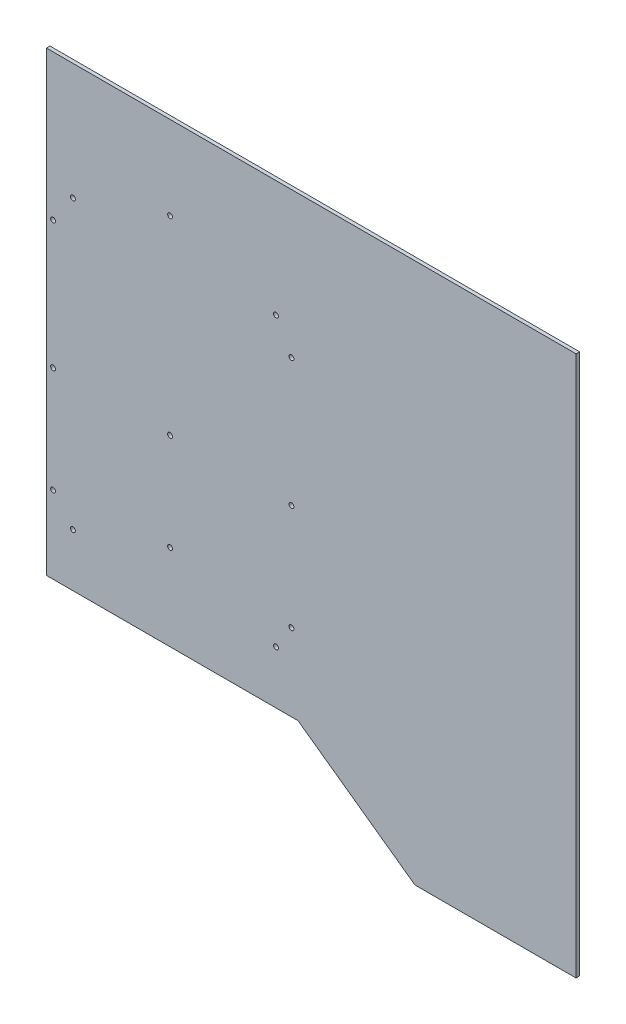
ISO-10303-21;
HEADER;
FILE_DESCRIPTION(('STEP AP214'),'2;1');
FILE_NAME('part.step','',(''),(''),'','','');
FILE_SCHEMA(('AUTOMOTIVE_DESIGN { 1 0 10303 214 1 1 1 1 }'));
ENDSEC;
DATA;
#1=APPLICATION_CONTEXT('core data for automotive mechanical design processes');
#2=APPLICATION_PROTOCOL_DEFINITION('international standard','automotive_design',2000,#1);
#3=PRODUCT_CONTEXT('',#1,'mechanical');
#4=PRODUCT('Part','Part','',(#3));
#5=PRODUCT_RELATED_PRODUCT_CATEGORY('part','',(#4));
#6=PRODUCT_DEFINITION_FORMATION('','',#4);
#7=PRODUCT_DEFINITION_CONTEXT('part definition',#1,'design');
#8=PRODUCT_DEFINITION('design','',#6,#7);
#9=PRODUCT_DEFINITION_SHAPE('','',#8);
#10=(LENGTH_UNIT() NAMED_UNIT(*) SI_UNIT(.MILLI.,.METRE.));
#11=(NAMED_UNIT(*) PLANE_ANGLE_UNIT() SI_UNIT($,.RADIAN.));
#12=(NAMED_UNIT(*) SI_UNIT($,.STERADIAN.) SOLID_ANGLE_UNIT());
#13=UNCERTAINTY_MEASURE_WITH_UNIT(LENGTH_MEASURE(1.E-05),#10,'distance_accuracy_value','');
#14=(GEOMETRIC_REPRESENTATION_CONTEXT(3) GLOBAL_UNCERTAINTY_ASSIGNED_CONTEXT((#13)) GLOBAL_UNIT_ASSIGNED_CONTEXT((#10,
#11,#12)) REPRESENTATION_CONTEXT('',''));
#15=CARTESIAN_POINT('',(0.,0.,0.));
#16=DIRECTION('',(0.,0.,1.));
#17=DIRECTION('',(1.,0.,0.));
#18=AXIS2_PLACEMENT_3D('',#15,#16,#17);
#19=CARTESIAN_POINT('',(-600.,-435.,8.));
#20=DIRECTION('',(1.,0.,0.));
#21=DIRECTION('',(0.,0.,-1.));
#22=AXIS2_PLACEMENT_3D('',#19,#20,#21);
#23=PLANE('',#22);
#24=DIRECTION('',(0.,-1.,0.));
#25=VECTOR('',#24,1.);
#26=CARTESIAN_POINT('',(-600.,-435.,0.));
#27=LINE('',#26,#25);
#28=CARTESIAN_POINT('',(-600.,600.,0.));
#29=VERTEX_POINT('',#28);
#30=CARTESIAN_POINT('',(-600.,-435.,0.));
#31=VERTEX_POINT('',#30);
#32=EDGE_CURVE('E128',#29,#31,#27,.T.);
#33=ORIENTED_EDGE('',*,*,#32,.T.);
#34=DIRECTION('',(0.,0.,-1.));
#35=VECTOR('',#34,1.);
#36=CARTESIAN_POINT('',(-600.,-435.,8.));
#37=LINE('',#36,#35);
#38=CARTESIAN_POINT('',(-600.,-435.,8.));
#39=VERTEX_POINT('',#38);
#40=EDGE_CURVE('E11',#39,#31,#37,.T.);
#41=ORIENTED_EDGE('',*,*,#40,.F.);
#42=DIRECTION('',(0.,-1.,0.));
#43=VECTOR('',#42,1.);
#44=CARTESIAN_POINT('',(-600.,-435.,8.));
#45=LINE('',#44,#43);
#46=CARTESIAN_POINT('',(-600.,600.,8.));
#47=VERTEX_POINT('',#46);
#48=EDGE_CURVE('E145',#47,#39,#45,.T.);
#49=ORIENTED_EDGE('',*,*,#48,.F.);
#50=DIRECTION('',(0.,0.,-1.));
#51=VECTOR('',#50,1.);
#52=CARTESIAN_POINT('',(-600.,600.,8.));
#53=LINE('',#52,#51);
#54=EDGE_CURVE('E124',#47,#29,#53,.T.);
#55=ORIENTED_EDGE('',*,*,#54,.T.);
#56=EDGE_LOOP('',(#33,#41,#49,#55));
#57=FACE_BOUND('',#56,.T.);
#58=ADVANCED_FACE('F39',(#57),#23,.F.);
#59=CARTESIAN_POINT('',(-30.0000000000002,-435.,8.));
#60=DIRECTION('',(0.,1.,0.));
#61=DIRECTION('',(-1.,0.,0.));
#62=AXIS2_PLACEMENT_3D('',#59,#60,#61);
#63=PLANE('',#62);
#64=DIRECTION('',(1.,0.,0.));
#65=VECTOR('',#64,1.);
#66=CARTESIAN_POINT('',(-30.0000000000002,-435.,0.));
#67=LINE('',#66,#65);
#68=CARTESIAN_POINT('',(-30.0000000000002,-435.,0.));
#69=VERTEX_POINT('',#68);
#70=EDGE_CURVE('E132',#31,#69,#67,.T.);
#71=ORIENTED_EDGE('',*,*,#70,.T.);
#72=DIRECTION('',(0.,0.,-1.));
#73=VECTOR('',#72,1.);
#74=CARTESIAN_POINT('',(-30.0000000000002,-435.,8.));
#75=LINE('',#74,#73);
#76=CARTESIAN_POINT('',(-30.0000000000002,-435.,8.));
#77=VERTEX_POINT('',#76);
#78=EDGE_CURVE('E48',#77,#69,#75,.T.);
#79=ORIENTED_EDGE('',*,*,#78,.F.);
#80=DIRECTION('',(1.,0.,0.));
#81=VECTOR('',#80,1.);
#82=CARTESIAN_POINT('',(-30.0000000000002,-435.,8.));
#83=LINE('',#82,#81);
#84=EDGE_CURVE('E93',#39,#77,#83,.T.);
#85=ORIENTED_EDGE('',*,*,#84,.F.);
#86=ORIENTED_EDGE('',*,*,#40,.T.);
#87=EDGE_LOOP('',(#71,#79,#85,#86));
#88=FACE_BOUND('',#87,.T.);
#89=ADVANCED_FACE('F174',(#88),#63,.F.);
#90=CARTESIAN_POINT('',(235.,-625.,8.));
#91=DIRECTION('',(0.582687773294948,0.812696104858744,0.));
#92=DIRECTION('',(-0.812696104858745,0.582687773294948,0.));
#93=AXIS2_PLACEMENT_3D('',#90,#91,#92);
#94=PLANE('',#93);
#95=DIRECTION('',(0.812696104858744,-0.582687773294948,0.));
#96=VECTOR('',#95,1.);
#97=CARTESIAN_POINT('',(235.,-625.,0.));
#98=LINE('',#97,#96);
#99=CARTESIAN_POINT('',(235.,-625.,0.));
#100=VERTEX_POINT('',#99);
#101=EDGE_CURVE('E136',#69,#100,#98,.T.);
#102=ORIENTED_EDGE('',*,*,#101,.T.);
#103=DIRECTION('',(0.,0.,-1.));
#104=VECTOR('',#103,1.);
#105=CARTESIAN_POINT('',(235.,-625.,8.));
#106=LINE('',#105,#104);
#107=CARTESIAN_POINT('',(235.,-625.,8.));
#108=VERTEX_POINT('',#107);
#109=EDGE_CURVE('E117',#108,#100,#106,.T.);
#110=ORIENTED_EDGE('',*,*,#109,.F.);
#111=DIRECTION('',(0.812696104858744,-0.582687773294948,0.));
#112=VECTOR('',#111,1.);
#113=CARTESIAN_POINT('',(235.,-625.,8.));
#114=LINE('',#113,#112);
#115=EDGE_CURVE('E106',#77,#108,#114,.T.);
#116=ORIENTED_EDGE('',*,*,#115,.F.);
#117=ORIENTED_EDGE('',*,*,#78,.T.);
#118=EDGE_LOOP('',(#102,#110,#116,#117));
#119=FACE_BOUND('',#118,.T.);
#120=ADVANCED_FACE('F155',(#119),#94,.F.);
#121=CARTESIAN_POINT('',(600.,-625.,8.));
#122=DIRECTION('',(0.,1.,0.));
#123=DIRECTION('',(-1.,0.,0.));
#124=AXIS2_PLACEMENT_3D('',#121,#122,#123);
#125=PLANE('',#124);
#126=DIRECTION('',(1.,0.,0.));
#127=VECTOR('',#126,1.);
#128=CARTESIAN_POINT('',(600.,-625.,0.));
#129=LINE('',#128,#127);
#130=CARTESIAN_POINT('',(600.,-625.,0.));
#131=VERTEX_POINT('',#130);
#132=EDGE_CURVE('E115',#100,#131,#129,.T.);
#133=ORIENTED_EDGE('',*,*,#132,.T.);
#134=DIRECTION('',(0.,0.,-1.));
#135=VECTOR('',#134,1.);
#136=CARTESIAN_POINT('',(600.,-625.,8.));
#137=LINE('',#136,#135);
#138=CARTESIAN_POINT('',(600.,-625.,8.));
#139=VERTEX_POINT('',#138);
#140=EDGE_CURVE('E112',#139,#131,#137,.T.);
#141=ORIENTED_EDGE('',*,*,#140,.F.);
#142=DIRECTION('',(1.,0.,0.));
#143=VECTOR('',#142,1.);
#144=CARTESIAN_POINT('',(600.,-625.,8.));
#145=LINE('',#144,#143);
#146=EDGE_CURVE('E100',#108,#139,#145,.T.);
#147=ORIENTED_EDGE('',*,*,#146,.F.);
#148=ORIENTED_EDGE('',*,*,#109,.T.);
#149=EDGE_LOOP('',(#133,#141,#147,#148));
#150=FACE_BOUND('',#149,.T.);
#151=ADVANCED_FACE('F113',(#150),#125,.F.);
#152=CARTESIAN_POINT('',(600.,600.,8.));
#153=DIRECTION('',(-1.,0.,0.));
#154=DIRECTION('',(0.,-1.,0.));
#155=AXIS2_PLACEMENT_3D('',#152,#153,#154);
#156=PLANE('',#155);
#157=DIRECTION('',(0.,1.,0.));
#158=VECTOR('',#157,1.);
#159=CARTESIAN_POINT('',(600.,600.,0.));
#160=LINE('',#159,#158);
#161=CARTESIAN_POINT('',(600.,600.,0.));
#162=VERTEX_POINT('',#161);
#163=EDGE_CURVE('E79',#131,#162,#160,.T.);
#164=ORIENTED_EDGE('',*,*,#163,.T.);
#165=DIRECTION('',(0.,0.,-1.));
#166=VECTOR('',#165,1.);
#167=CARTESIAN_POINT('',(600.,600.,8.));
#168=LINE('',#167,#166);
#169=CARTESIAN_POINT('',(600.,600.,8.));
#170=VERTEX_POINT('',#169);
#171=EDGE_CURVE('E118',#170,#162,#168,.T.);
#172=ORIENTED_EDGE('',*,*,#171,.F.);
#173=DIRECTION('',(0.,1.,0.));
#174=VECTOR('',#173,1.);
#175=CARTESIAN_POINT('',(600.,600.,8.));
#176=LINE('',#175,#174);
#177=EDGE_CURVE('E104',#139,#170,#176,.T.);
#178=ORIENTED_EDGE('',*,*,#177,.F.);
#179=ORIENTED_EDGE('',*,*,#140,.T.);
#180=EDGE_LOOP('',(#164,#172,#178,#179));
#181=FACE_BOUND('',#180,.T.);
#182=ADVANCED_FACE('F120',(#181),#156,.F.);
#183=CARTESIAN_POINT('',(-600.,600.,8.));
#184=DIRECTION('',(0.,-1.,0.));
#185=DIRECTION('',(0.,0.,-1.));
#186=AXIS2_PLACEMENT_3D('',#183,#184,#185);
#187=PLANE('',#186);
#188=DIRECTION('',(-1.,0.,0.));
#189=VECTOR('',#188,1.);
#190=CARTESIAN_POINT('',(-600.,600.,0.));
#191=LINE('',#190,#189);
#192=EDGE_CURVE('E85',#162,#29,#191,.T.);
#193=ORIENTED_EDGE('',*,*,#192,.T.);
#194=ORIENTED_EDGE('',*,*,#54,.F.);
#195=DIRECTION('',(-1.,0.,0.));
#196=VECTOR('',#195,1.);
#197=CARTESIAN_POINT('',(-600.,600.,8.));
#198=LINE('',#197,#196);
#199=EDGE_CURVE('E56',#170,#47,#198,.T.);
#200=ORIENTED_EDGE('',*,*,#199,.F.);
#201=ORIENTED_EDGE('',*,*,#171,.T.);
#202=EDGE_LOOP('',(#193,#194,#200,#201));
#203=FACE_BOUND('',#202,.T.);
#204=ADVANCED_FACE('F162',(#203),#187,.F.);
#205=CARTESIAN_POINT('',(0.,0.,8.));
#206=DIRECTION('',(0.,0.,-1.));
#207=DIRECTION('',(-1.,0.,0.));
#208=AXIS2_PLACEMENT_3D('',#205,#206,#207);
#209=PLANE('',#208);
#210=CARTESIAN_POINT('',(-540.,336.,8.));
#211=DIRECTION('',(0.,0.,1.));
#212=DIRECTION('',(1.,0.,0.));
#213=AXIS2_PLACEMENT_3D('',#210,#211,#212);
#214=CIRCLE('',#213,5.49999999999996);
#215=CARTESIAN_POINT('',(-534.5,336.,8.));
#216=VERTEX_POINT('',#215);
#217=EDGE_CURVE('E347',#216,#216,#214,.T.);
#218=ORIENTED_EDGE('',*,*,#217,.F.);
#219=EDGE_LOOP('',(#218));
#220=FACE_BOUND('',#219,.T.);
#221=CARTESIAN_POINT('',(-585.,-20.0000000000002,8.));
#222=DIRECTION('',(0.,0.,1.));
#223=DIRECTION('',(1.,0.,0.));
#224=AXIS2_PLACEMENT_3D('',#221,#222,#223);
#225=CIRCLE('',#224,5.49999999999996);
#226=CARTESIAN_POINT('',(-579.5,-20.0000000000002,8.));
#227=VERTEX_POINT('',#226);
#228=EDGE_CURVE('E363',#227,#227,#225,.T.);
#229=ORIENTED_EDGE('',*,*,#228,.F.);
#230=EDGE_LOOP('',(#229));
#231=FACE_BOUND('',#230,.T.);
#232=CARTESIAN_POINT('',(-44.8722661893196,270.,8.));
#233=DIRECTION('',(0.,0.,1.));
#234=DIRECTION('',(1.,0.,0.));
#235=AXIS2_PLACEMENT_3D('',#232,#233,#234);
#236=CIRCLE('',#235,5.5);
#237=CARTESIAN_POINT('',(-39.3722661893196,270.,8.));
#238=VERTEX_POINT('',#237);
#239=EDGE_CURVE('E452',#238,#238,#236,.T.);
#240=ORIENTED_EDGE('',*,*,#239,.F.);
#241=EDGE_LOOP('',(#240));
#242=FACE_BOUND('',#241,.T.);
#243=CARTESIAN_POINT('',(-585.,270.,8.));
#244=DIRECTION('',(0.,0.,1.));
#245=DIRECTION('',(1.,0.,0.));
#246=AXIS2_PLACEMENT_3D('',#243,#244,#245);
#247=CIRCLE('',#246,5.49999999999996);
#248=CARTESIAN_POINT('',(-579.5,270.,8.));
#249=VERTEX_POINT('',#248);
#250=EDGE_CURVE('E460',#249,#249,#247,.T.);
#251=ORIENTED_EDGE('',*,*,#250,.F.);
#252=EDGE_LOOP('',(#251));
#253=FACE_BOUND('',#252,.T.);
#254=CARTESIAN_POINT('',(-79.8722661893196,336.,8.));
#255=DIRECTION('',(0.,0.,1.));
#256=DIRECTION('',(1.,0.,0.));
#257=AXIS2_PLACEMENT_3D('',#254,#255,#256);
#258=CIRCLE('',#257,5.5);
#259=CARTESIAN_POINT('',(-74.3722661893196,336.,8.));
#260=VERTEX_POINT('',#259);
#261=EDGE_CURVE('E352',#260,#260,#258,.T.);
#262=ORIENTED_EDGE('',*,*,#261,.F.);
#263=EDGE_LOOP('',(#262));
#264=FACE_BOUND('',#263,.T.);
#265=CARTESIAN_POINT('',(-44.8722661893196,-20.0000000000002,8.));
#266=DIRECTION('',(0.,0.,1.));
#267=DIRECTION('',(1.,0.,0.));
#268=AXIS2_PLACEMENT_3D('',#265,#266,#267);
#269=CIRCLE('',#268,5.5);
#270=CARTESIAN_POINT('',(-39.3722661893196,-20.0000000000002,8.));
#271=VERTEX_POINT('',#270);
#272=EDGE_CURVE('E389',#271,#271,#269,.T.);
#273=ORIENTED_EDGE('',*,*,#272,.F.);
#274=EDGE_LOOP('',(#273));
#275=FACE_BOUND('',#274,.T.);
#276=CARTESIAN_POINT('',(-44.8722661893195,-260.,8.));
#277=DIRECTION('',(0.,0.,1.));
#278=DIRECTION('',(1.,0.,0.));
#279=AXIS2_PLACEMENT_3D('',#276,#277,#278);
#280=CIRCLE('',#279,5.5);
#281=CARTESIAN_POINT('',(-39.3722661893195,-260.,8.));
#282=VERTEX_POINT('',#281);
#283=EDGE_CURVE('E381',#282,#282,#280,.T.);
#284=ORIENTED_EDGE('',*,*,#283,.F.);
#285=EDGE_LOOP('',(#284));
#286=FACE_BOUND('',#285,.T.);
#287=CARTESIAN_POINT('',(-79.8722661893195,-315.,8.));
#288=DIRECTION('',(0.,0.,1.));
#289=DIRECTION('',(1.,0.,0.));
#290=AXIS2_PLACEMENT_3D('',#287,#288,#289);
#291=CIRCLE('',#290,5.5);
#292=CARTESIAN_POINT('',(-74.3722661893195,-315.,8.));
#293=VERTEX_POINT('',#292);
#294=EDGE_CURVE('E371',#293,#293,#291,.T.);
#295=ORIENTED_EDGE('',*,*,#294,.F.);
#296=EDGE_LOOP('',(#295));
#297=FACE_BOUND('',#296,.T.);
#298=CARTESIAN_POINT('',(-319.872266189319,411.,8.));
#299=DIRECTION('',(0.,0.,1.));
#300=DIRECTION('',(1.,0.,0.));
#301=AXIS2_PLACEMENT_3D('',#298,#299,#300);
#302=CIRCLE('',#301,5.50000000000002);
#303=CARTESIAN_POINT('',(-314.372266189319,411.,8.));
#304=VERTEX_POINT('',#303);
#305=EDGE_CURVE('E470',#304,#304,#302,.T.);
#306=ORIENTED_EDGE('',*,*,#305,.F.);
#307=EDGE_LOOP('',(#306));
#308=FACE_BOUND('',#307,.T.);
#309=CARTESIAN_POINT('',(-319.87226618932,-20.0000000000002,8.));
#310=DIRECTION('',(0.,0.,1.));
#311=DIRECTION('',(1.,0.,0.));
#312=AXIS2_PLACEMENT_3D('',#309,#310,#311);
#313=CIRCLE('',#312,5.50000000000002);
#314=CARTESIAN_POINT('',(-314.37226618932,-20.0000000000002,8.));
#315=VERTEX_POINT('',#314);
#316=EDGE_CURVE('E476',#315,#315,#313,.T.);
#317=ORIENTED_EDGE('',*,*,#316,.F.);
#318=EDGE_LOOP('',(#317));
#319=FACE_BOUND('',#318,.T.);
#320=CARTESIAN_POINT('',(-319.872266189319,-240.,8.));
#321=DIRECTION('',(0.,0.,1.));
#322=DIRECTION('',(1.,0.,0.));
#323=AXIS2_PLACEMENT_3D('',#320,#321,#322);
#324=CIRCLE('',#323,5.50000000000002);
#325=CARTESIAN_POINT('',(-314.372266189319,-240.,8.));
#326=VERTEX_POINT('',#325);
#327=EDGE_CURVE('E441',#326,#326,#324,.T.);
#328=ORIENTED_EDGE('',*,*,#327,.F.);
#329=EDGE_LOOP('',(#328));
#330=FACE_BOUND('',#329,.T.);
#331=CARTESIAN_POINT('',(-585.,-260.,8.));
#332=DIRECTION('',(0.,0.,1.));
#333=DIRECTION('',(1.,0.,0.));
#334=AXIS2_PLACEMENT_3D('',#331,#332,#333);
#335=CIRCLE('',#334,5.49999999999996);
#336=CARTESIAN_POINT('',(-579.5,-260.,8.));
#337=VERTEX_POINT('',#336);
#338=EDGE_CURVE('E442',#337,#337,#335,.T.);
#339=ORIENTED_EDGE('',*,*,#338,.F.);
#340=EDGE_LOOP('',(#339));
#341=FACE_BOUND('',#340,.T.);
#342=CARTESIAN_POINT('',(-540.,-315.,8.));
#343=DIRECTION('',(0.,0.,1.));
#344=DIRECTION('',(1.,0.,0.));
#345=AXIS2_PLACEMENT_3D('',#342,#343,#344);
#346=CIRCLE('',#345,5.49999999999996);
#347=CARTESIAN_POINT('',(-534.5,-315.,8.));
#348=VERTEX_POINT('',#347);
#349=EDGE_CURVE('E380',#348,#348,#346,.T.);
#350=ORIENTED_EDGE('',*,*,#349,.F.);
#351=EDGE_LOOP('',(#350));
#352=FACE_BOUND('',#351,.T.);
#353=ORIENTED_EDGE('',*,*,#48,.T.);
#354=ORIENTED_EDGE('',*,*,#84,.T.);
#355=ORIENTED_EDGE('',*,*,#115,.T.);
#356=ORIENTED_EDGE('',*,*,#146,.T.);
#357=ORIENTED_EDGE('',*,*,#177,.T.);
#358=ORIENTED_EDGE('',*,*,#199,.T.);
#359=EDGE_LOOP('',(#353,#354,#355,#356,#357,#358));
#360=FACE_BOUND('',#359,.T.);
#361=ADVANCED_FACE('F102',(#220,#231,#242,#253,#264,#275,#286,#297,#308,#319,#330,#341,#352,
#360),#209,.F.);
#362=CARTESIAN_POINT('',(0.,0.,0.));
#363=DIRECTION('',(0.,0.,-1.));
#364=DIRECTION('',(-1.,0.,0.));
#365=AXIS2_PLACEMENT_3D('',#362,#363,#364);
#366=PLANE('',#365);
#367=CARTESIAN_POINT('',(-540.,336.,0.));
#368=DIRECTION('',(0.,0.,-1.));
#369=DIRECTION('',(-1.,0.,0.));
#370=AXIS2_PLACEMENT_3D('',#367,#368,#369);
#371=CIRCLE('',#370,5.49999999999996);
#372=CARTESIAN_POINT('',(-545.5,336.,0.));
#373=VERTEX_POINT('',#372);
#374=EDGE_CURVE('E350',#373,#373,#371,.F.);
#375=ORIENTED_EDGE('',*,*,#374,.T.);
#376=EDGE_LOOP('',(#375));
#377=FACE_BOUND('',#376,.T.);
#378=CARTESIAN_POINT('',(-585.,-20.0000000000002,0.));
#379=DIRECTION('',(0.,0.,-1.));
#380=DIRECTION('',(-1.,0.,0.));
#381=AXIS2_PLACEMENT_3D('',#378,#379,#380);
#382=CIRCLE('',#381,5.49999999999996);
#383=CARTESIAN_POINT('',(-590.5,-20.0000000000002,0.));
#384=VERTEX_POINT('',#383);
#385=EDGE_CURVE('E359',#384,#384,#382,.F.);
#386=ORIENTED_EDGE('',*,*,#385,.T.);
#387=EDGE_LOOP('',(#386));
#388=FACE_BOUND('',#387,.T.);
#389=CARTESIAN_POINT('',(-44.8722661893196,270.,0.));
#390=DIRECTION('',(0.,0.,-1.));
#391=DIRECTION('',(-1.,0.,0.));
#392=AXIS2_PLACEMENT_3D('',#389,#390,#391);
#393=CIRCLE('',#392,5.5);
#394=CARTESIAN_POINT('',(-50.3722661893196,270.,0.));
#395=VERTEX_POINT('',#394);
#396=EDGE_CURVE('E367',#395,#395,#393,.F.);
#397=ORIENTED_EDGE('',*,*,#396,.T.);
#398=EDGE_LOOP('',(#397));
#399=FACE_BOUND('',#398,.T.);
#400=CARTESIAN_POINT('',(-585.,270.,0.));
#401=DIRECTION('',(0.,0.,-1.));
#402=DIRECTION('',(-1.,0.,0.));
#403=AXIS2_PLACEMENT_3D('',#400,#401,#402);
#404=CIRCLE('',#403,5.49999999999996);
#405=CARTESIAN_POINT('',(-590.5,270.,0.));
#406=VERTEX_POINT('',#405);
#407=EDGE_CURVE('E456',#406,#406,#404,.F.);
#408=ORIENTED_EDGE('',*,*,#407,.T.);
#409=EDGE_LOOP('',(#408));
#410=FACE_BOUND('',#409,.T.);
#411=CARTESIAN_POINT('',(-79.8722661893196,336.,0.));
#412=DIRECTION('',(0.,0.,-1.));
#413=DIRECTION('',(-1.,0.,0.));
#414=AXIS2_PLACEMENT_3D('',#411,#412,#413);
#415=CIRCLE('',#414,5.5);
#416=CARTESIAN_POINT('',(-85.3722661893196,336.,0.));
#417=VERTEX_POINT('',#416);
#418=EDGE_CURVE('E357',#417,#417,#415,.F.);
#419=ORIENTED_EDGE('',*,*,#418,.T.);
#420=EDGE_LOOP('',(#419));
#421=FACE_BOUND('',#420,.T.);
#422=CARTESIAN_POINT('',(-44.8722661893196,-20.0000000000002,0.));
#423=DIRECTION('',(0.,0.,-1.));
#424=DIRECTION('',(-1.,0.,0.));
#425=AXIS2_PLACEMENT_3D('',#422,#423,#424);
#426=CIRCLE('',#425,5.5);
#427=CARTESIAN_POINT('',(-50.3722661893196,-20.0000000000002,0.));
#428=VERTEX_POINT('',#427);
#429=EDGE_CURVE('E385',#428,#428,#426,.F.);
#430=ORIENTED_EDGE('',*,*,#429,.T.);
#431=EDGE_LOOP('',(#430));
#432=FACE_BOUND('',#431,.T.);
#433=CARTESIAN_POINT('',(-44.8722661893195,-260.,0.));
#434=DIRECTION('',(0.,0.,-1.));
#435=DIRECTION('',(-1.,0.,0.));
#436=AXIS2_PLACEMENT_3D('',#433,#434,#435);
#437=CIRCLE('',#436,5.5);
#438=CARTESIAN_POINT('',(-50.3722661893195,-260.,0.));
#439=VERTEX_POINT('',#438);
#440=EDGE_CURVE('E376',#439,#439,#437,.F.);
#441=ORIENTED_EDGE('',*,*,#440,.T.);
#442=EDGE_LOOP('',(#441));
#443=FACE_BOUND('',#442,.T.);
#444=CARTESIAN_POINT('',(-79.8722661893195,-315.,0.));
#445=DIRECTION('',(0.,0.,-1.));
#446=DIRECTION('',(-1.,0.,0.));
#447=AXIS2_PLACEMENT_3D('',#444,#445,#446);
#448=CIRCLE('',#447,5.5);
#449=CARTESIAN_POINT('',(-85.3722661893195,-315.,0.));
#450=VERTEX_POINT('',#449);
#451=EDGE_CURVE('E375',#450,#450,#448,.F.);
#452=ORIENTED_EDGE('',*,*,#451,.T.);
#453=EDGE_LOOP('',(#452));
#454=FACE_BOUND('',#453,.T.);
#455=CARTESIAN_POINT('',(-319.872266189319,411.,0.));
#456=DIRECTION('',(0.,0.,-1.));
#457=DIRECTION('',(-1.,0.,0.));
#458=AXIS2_PLACEMENT_3D('',#455,#456,#457);
#459=CIRCLE('',#458,5.50000000000002);
#460=CARTESIAN_POINT('',(-325.372266189319,411.,0.));
#461=VERTEX_POINT('',#460);
#462=EDGE_CURVE('E427',#461,#461,#459,.F.);
#463=ORIENTED_EDGE('',*,*,#462,.T.);
#464=EDGE_LOOP('',(#463));
#465=FACE_BOUND('',#464,.T.);
#466=CARTESIAN_POINT('',(-319.87226618932,-20.0000000000002,0.));
#467=DIRECTION('',(0.,0.,-1.));
#468=DIRECTION('',(-1.,0.,0.));
#469=AXIS2_PLACEMENT_3D('',#466,#467,#468);
#470=CIRCLE('',#469,5.50000000000002);
#471=CARTESIAN_POINT('',(-325.37226618932,-20.0000000000002,0.));
#472=VERTEX_POINT('',#471);
#473=EDGE_CURVE('E431',#472,#472,#470,.F.);
#474=ORIENTED_EDGE('',*,*,#473,.T.);
#475=EDGE_LOOP('',(#474));
#476=FACE_BOUND('',#475,.T.);
#477=CARTESIAN_POINT('',(-319.872266189319,-240.,0.));
#478=DIRECTION('',(0.,0.,-1.));
#479=DIRECTION('',(-1.,0.,0.));
#480=AXIS2_PLACEMENT_3D('',#477,#478,#479);
#481=CIRCLE('',#480,5.50000000000002);
#482=CARTESIAN_POINT('',(-325.372266189319,-240.,0.));
#483=VERTEX_POINT('',#482);
#484=EDGE_CURVE('E435',#483,#483,#481,.F.);
#485=ORIENTED_EDGE('',*,*,#484,.T.);
#486=EDGE_LOOP('',(#485));
#487=FACE_BOUND('',#486,.T.);
#488=CARTESIAN_POINT('',(-585.,-260.,0.));
#489=DIRECTION('',(0.,0.,-1.));
#490=DIRECTION('',(-1.,0.,0.));
#491=AXIS2_PLACEMENT_3D('',#488,#489,#490);
#492=CIRCLE('',#491,5.49999999999996);
#493=CARTESIAN_POINT('',(-590.5,-260.,0.));
#494=VERTEX_POINT('',#493);
#495=EDGE_CURVE('E438',#494,#494,#492,.F.);
#496=ORIENTED_EDGE('',*,*,#495,.T.);
#497=EDGE_LOOP('',(#496));
#498=FACE_BOUND('',#497,.T.);
#499=CARTESIAN_POINT('',(-540.,-315.,0.));
#500=DIRECTION('',(0.,0.,-1.));
#501=DIRECTION('',(-1.,0.,0.));
#502=AXIS2_PLACEMENT_3D('',#499,#500,#501);
#503=CIRCLE('',#502,5.49999999999996);
#504=CARTESIAN_POINT('',(-545.5,-315.,0.));
#505=VERTEX_POINT('',#504);
#506=EDGE_CURVE('E133',#505,#505,#503,.F.);
#507=ORIENTED_EDGE('',*,*,#506,.T.);
#508=EDGE_LOOP('',(#507));
#509=FACE_BOUND('',#508,.T.);
#510=ORIENTED_EDGE('',*,*,#32,.F.);
#511=ORIENTED_EDGE('',*,*,#192,.F.);
#512=ORIENTED_EDGE('',*,*,#163,.F.);
#513=ORIENTED_EDGE('',*,*,#132,.F.);
#514=ORIENTED_EDGE('',*,*,#101,.F.);
#515=ORIENTED_EDGE('',*,*,#70,.F.);
#516=EDGE_LOOP('',(#510,#511,#512,#513,#514,#515));
#517=FACE_BOUND('',#516,.T.);
#518=ADVANCED_FACE('F158',(#377,#388,#399,#410,#421,#432,#443,#454,#465,#476,#487,#498,#509,
#517),#366,.T.);
#519=CARTESIAN_POINT('',(-540.,-315.,-15.5563491861041));
#520=DIRECTION('',(0.,0.,1.));
#521=DIRECTION('',(1.,0.,0.));
#522=AXIS2_PLACEMENT_3D('',#519,#520,#521);
#523=CYLINDRICAL_SURFACE('',#522,5.49999999999996);
#524=ORIENTED_EDGE('',*,*,#349,.T.);
#525=EDGE_LOOP('',(#524));
#526=FACE_BOUND('',#525,.T.);
#527=ORIENTED_EDGE('',*,*,#506,.F.);
#528=EDGE_LOOP('',(#527));
#529=FACE_BOUND('',#528,.T.);
#530=ADVANCED_FACE('F211',(#526,#529),#523,.F.);
#531=CARTESIAN_POINT('',(-585.,-260.,-15.5563491861041));
#532=DIRECTION('',(0.,0.,1.));
#533=DIRECTION('',(1.,0.,0.));
#534=AXIS2_PLACEMENT_3D('',#531,#532,#533);
#535=CYLINDRICAL_SURFACE('',#534,5.49999999999996);
#536=ORIENTED_EDGE('',*,*,#338,.T.);
#537=EDGE_LOOP('',(#536));
#538=FACE_BOUND('',#537,.T.);
#539=ORIENTED_EDGE('',*,*,#495,.F.);
#540=EDGE_LOOP('',(#539));
#541=FACE_BOUND('',#540,.T.);
#542=ADVANCED_FACE('F220',(#538,#541),#535,.F.);
#543=CARTESIAN_POINT('',(-319.872266189319,-240.,-15.5563491861041));
#544=DIRECTION('',(0.,0.,1.));
#545=DIRECTION('',(1.,0.,0.));
#546=AXIS2_PLACEMENT_3D('',#543,#544,#545);
#547=CYLINDRICAL_SURFACE('',#546,5.50000000000002);
#548=ORIENTED_EDGE('',*,*,#327,.T.);
#549=EDGE_LOOP('',(#548));
#550=FACE_BOUND('',#549,.T.);
#551=ORIENTED_EDGE('',*,*,#484,.F.);
#552=EDGE_LOOP('',(#551));
#553=FACE_BOUND('',#552,.T.);
#554=ADVANCED_FACE('F230',(#550,#553),#547,.F.);
#555=CARTESIAN_POINT('',(-319.87226618932,-20.0000000000002,-15.5563491861041));
#556=DIRECTION('',(0.,0.,1.));
#557=DIRECTION('',(1.,0.,0.));
#558=AXIS2_PLACEMENT_3D('',#555,#556,#557);
#559=CYLINDRICAL_SURFACE('',#558,5.50000000000002);
#560=ORIENTED_EDGE('',*,*,#316,.T.);
#561=EDGE_LOOP('',(#560));
#562=FACE_BOUND('',#561,.T.);
#563=ORIENTED_EDGE('',*,*,#473,.F.);
#564=EDGE_LOOP('',(#563));
#565=FACE_BOUND('',#564,.T.);
#566=ADVANCED_FACE('F240',(#562,#565),#559,.F.);
#567=CARTESIAN_POINT('',(-319.872266189319,411.,-15.5563491861041));
#568=DIRECTION('',(0.,0.,1.));
#569=DIRECTION('',(1.,0.,0.));
#570=AXIS2_PLACEMENT_3D('',#567,#568,#569);
#571=CYLINDRICAL_SURFACE('',#570,5.50000000000002);
#572=ORIENTED_EDGE('',*,*,#305,.T.);
#573=EDGE_LOOP('',(#572));
#574=FACE_BOUND('',#573,.T.);
#575=ORIENTED_EDGE('',*,*,#462,.F.);
#576=EDGE_LOOP('',(#575));
#577=FACE_BOUND('',#576,.T.);
#578=ADVANCED_FACE('F250',(#574,#577),#571,.F.);
#579=CARTESIAN_POINT('',(-79.8722661893195,-315.,-15.5563491861041));
#580=DIRECTION('',(0.,0.,1.));
#581=DIRECTION('',(1.,0.,0.));
#582=AXIS2_PLACEMENT_3D('',#579,#580,#581);
#583=CYLINDRICAL_SURFACE('',#582,5.5);
#584=ORIENTED_EDGE('',*,*,#294,.T.);
#585=EDGE_LOOP('',(#584));
#586=FACE_BOUND('',#585,.T.);
#587=ORIENTED_EDGE('',*,*,#451,.F.);
#588=EDGE_LOOP('',(#587));
#589=FACE_BOUND('',#588,.T.);
#590=ADVANCED_FACE('F260',(#586,#589),#583,.F.);
#591=CARTESIAN_POINT('',(-44.8722661893195,-260.,-15.5563491861041));
#592=DIRECTION('',(0.,0.,1.));
#593=DIRECTION('',(1.,0.,0.));
#594=AXIS2_PLACEMENT_3D('',#591,#592,#593);
#595=CYLINDRICAL_SURFACE('',#594,5.5);
#596=ORIENTED_EDGE('',*,*,#283,.T.);
#597=EDGE_LOOP('',(#596));
#598=FACE_BOUND('',#597,.T.);
#599=ORIENTED_EDGE('',*,*,#440,.F.);
#600=EDGE_LOOP('',(#599));
#601=FACE_BOUND('',#600,.T.);
#602=ADVANCED_FACE('F270',(#598,#601),#595,.F.);
#603=CARTESIAN_POINT('',(-44.8722661893196,-20.0000000000002,-15.5563491861041));
#604=DIRECTION('',(0.,0.,1.));
#605=DIRECTION('',(1.,0.,0.));
#606=AXIS2_PLACEMENT_3D('',#603,#604,#605);
#607=CYLINDRICAL_SURFACE('',#606,5.5);
#608=ORIENTED_EDGE('',*,*,#272,.T.);
#609=EDGE_LOOP('',(#608));
#610=FACE_BOUND('',#609,.T.);
#611=ORIENTED_EDGE('',*,*,#429,.F.);
#612=EDGE_LOOP('',(#611));
#613=FACE_BOUND('',#612,.T.);
#614=ADVANCED_FACE('F280',(#610,#613),#607,.F.);
#615=CARTESIAN_POINT('',(-79.8722661893196,336.,-15.5563491861041));
#616=DIRECTION('',(0.,0.,1.));
#617=DIRECTION('',(1.,0.,0.));
#618=AXIS2_PLACEMENT_3D('',#615,#616,#617);
#619=CYLINDRICAL_SURFACE('',#618,5.5);
#620=ORIENTED_EDGE('',*,*,#261,.T.);
#621=EDGE_LOOP('',(#620));
#622=FACE_BOUND('',#621,.T.);
#623=ORIENTED_EDGE('',*,*,#418,.F.);
#624=EDGE_LOOP('',(#623));
#625=FACE_BOUND('',#624,.T.);
#626=ADVANCED_FACE('F290',(#622,#625),#619,.F.);
#627=CARTESIAN_POINT('',(-585.,270.,-15.5563491861041));
#628=DIRECTION('',(0.,0.,1.));
#629=DIRECTION('',(1.,0.,0.));
#630=AXIS2_PLACEMENT_3D('',#627,#628,#629);
#631=CYLINDRICAL_SURFACE('',#630,5.49999999999996);
#632=ORIENTED_EDGE('',*,*,#250,.T.);
#633=EDGE_LOOP('',(#632));
#634=FACE_BOUND('',#633,.T.);
#635=ORIENTED_EDGE('',*,*,#407,.F.);
#636=EDGE_LOOP('',(#635));
#637=FACE_BOUND('',#636,.T.);
#638=ADVANCED_FACE('F300',(#634,#637),#631,.F.);
#639=CARTESIAN_POINT('',(-44.8722661893196,270.,-15.5563491861041));
#640=DIRECTION('',(0.,0.,1.));
#641=DIRECTION('',(1.,0.,0.));
#642=AXIS2_PLACEMENT_3D('',#639,#640,#641);
#643=CYLINDRICAL_SURFACE('',#642,5.5);
#644=ORIENTED_EDGE('',*,*,#239,.T.);
#645=EDGE_LOOP('',(#644));
#646=FACE_BOUND('',#645,.T.);
#647=ORIENTED_EDGE('',*,*,#396,.F.);
#648=EDGE_LOOP('',(#647));
#649=FACE_BOUND('',#648,.T.);
#650=ADVANCED_FACE('F310',(#646,#649),#643,.F.);
#651=CARTESIAN_POINT('',(-585.,-20.0000000000002,-15.5563491861041));
#652=DIRECTION('',(0.,0.,1.));
#653=DIRECTION('',(1.,0.,0.));
#654=AXIS2_PLACEMENT_3D('',#651,#652,#653);
#655=CYLINDRICAL_SURFACE('',#654,5.49999999999996);
#656=ORIENTED_EDGE('',*,*,#228,.T.);
#657=EDGE_LOOP('',(#656));
#658=FACE_BOUND('',#657,.T.);
#659=ORIENTED_EDGE('',*,*,#385,.F.);
#660=EDGE_LOOP('',(#659));
#661=FACE_BOUND('',#660,.T.);
#662=ADVANCED_FACE('F320',(#658,#661),#655,.F.);
#663=CARTESIAN_POINT('',(-540.,336.,-15.5563491861041));
#664=DIRECTION('',(0.,0.,1.));
#665=DIRECTION('',(1.,0.,0.));
#666=AXIS2_PLACEMENT_3D('',#663,#664,#665);
#667=CYLINDRICAL_SURFACE('',#666,5.49999999999996);
#668=ORIENTED_EDGE('',*,*,#217,.T.);
#669=EDGE_LOOP('',(#668));
#670=FACE_BOUND('',#669,.T.);
#671=ORIENTED_EDGE('',*,*,#374,.F.);
#672=EDGE_LOOP('',(#671));
#673=FACE_BOUND('',#672,.T.);
#674=ADVANCED_FACE('F330',(#670,#673),#667,.F.);
#675=CLOSED_SHELL('',(#58,#89,#120,#151,#182,#204,#361,#518,#530,#542,#554,#566,#578,#590,#602,
#614,#626,#638,#650,#662,#674));
#676=MANIFOLD_SOLID_BREP('B2',#675);
#677=ADVANCED_BREP_SHAPE_REPRESENTATION('',(#18,#676),#14);
#678=SHAPE_DEFINITION_REPRESENTATION(#9,#677);
ENDSEC;
END-ISO-10303-21;
